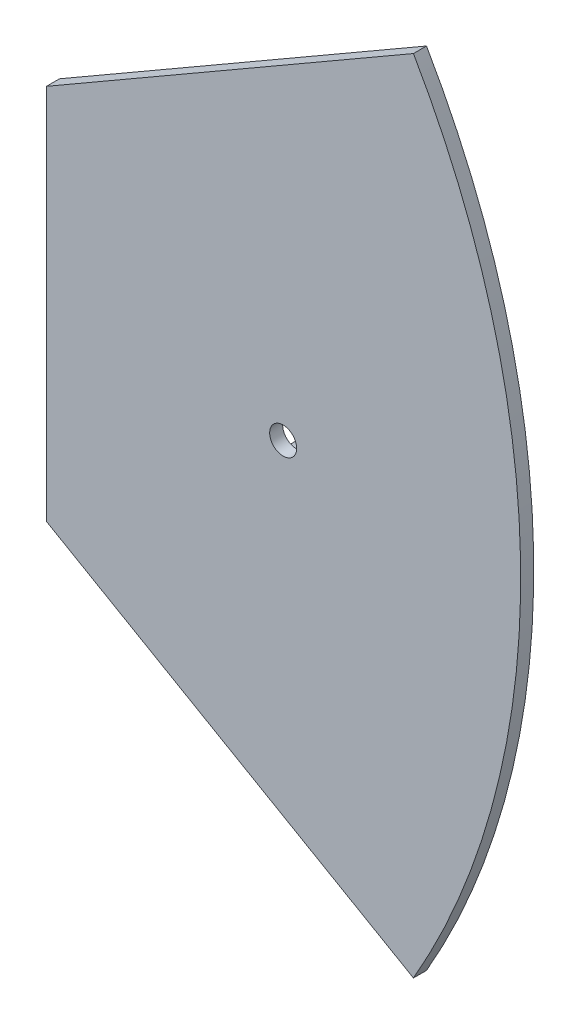
ISO-10303-21;
HEADER;
FILE_DESCRIPTION(('STEP AP214'),'2;1');
FILE_NAME('part.step','',(''),(''),'','','');
FILE_SCHEMA(('AUTOMOTIVE_DESIGN { 1 0 10303 214 1 1 1 1 }'));
ENDSEC;
DATA;
#1=APPLICATION_CONTEXT('core data for automotive mechanical design processes');
#2=APPLICATION_PROTOCOL_DEFINITION('international standard','automotive_design',2000,#1);
#3=PRODUCT_CONTEXT('',#1,'mechanical');
#4=PRODUCT('Part','Part','',(#3));
#5=PRODUCT_RELATED_PRODUCT_CATEGORY('part','',(#4));
#6=PRODUCT_DEFINITION_FORMATION('','',#4);
#7=PRODUCT_DEFINITION_CONTEXT('part definition',#1,'design');
#8=PRODUCT_DEFINITION('design','',#6,#7);
#9=PRODUCT_DEFINITION_SHAPE('','',#8);
#10=(LENGTH_UNIT() NAMED_UNIT(*) SI_UNIT(.MILLI.,.METRE.));
#11=(NAMED_UNIT(*) PLANE_ANGLE_UNIT() SI_UNIT($,.RADIAN.));
#12=(NAMED_UNIT(*) SI_UNIT($,.STERADIAN.) SOLID_ANGLE_UNIT());
#13=UNCERTAINTY_MEASURE_WITH_UNIT(LENGTH_MEASURE(1.E-05),#10,'distance_accuracy_value','');
#14=(GEOMETRIC_REPRESENTATION_CONTEXT(3) GLOBAL_UNCERTAINTY_ASSIGNED_CONTEXT((#13)) GLOBAL_UNIT_ASSIGNED_CONTEXT((#10,
#11,#12)) REPRESENTATION_CONTEXT('',''));
#15=CARTESIAN_POINT('',(0.,0.,0.));
#16=DIRECTION('',(0.,0.,1.));
#17=DIRECTION('',(1.,0.,0.));
#18=AXIS2_PLACEMENT_3D('',#15,#16,#17);
#19=CARTESIAN_POINT('',(0.,0.,44.));
#20=DIRECTION('',(0.,0.,1.));
#21=DIRECTION('',(1.,0.,0.));
#22=AXIS2_PLACEMENT_3D('',#19,#20,#21);
#23=PLANE('',#22);
#24=CARTESIAN_POINT('',(129.406241285554,0.,44.));
#25=DIRECTION('',(0.,0.,1.));
#26=DIRECTION('',(1.,0.,0.));
#27=AXIS2_PLACEMENT_3D('',#24,#25,#26);
#28=CIRCLE('',#27,3.09999999999999);
#29=CARTESIAN_POINT('',(132.506241285554,0.,44.));
#30=VERTEX_POINT('',#29);
#31=EDGE_CURVE('E153',#30,#30,#28,.T.);
#32=ORIENTED_EDGE('',*,*,#31,.T.);
#33=EDGE_LOOP('',(#32));
#34=FACE_BOUND('',#33,.T.);
#35=DIRECTION('',(0.,1.,0.));
#36=VECTOR('',#35,1.);
#37=CARTESIAN_POINT('',(133.812482571108,5.9529360582258,44.));
#38=LINE('',#37,#36);
#39=CARTESIAN_POINT('',(133.812482571108,5.9529360582258,44.));
#40=VERTEX_POINT('',#39);
#41=CARTESIAN_POINT('',(133.812482571109,21.8310469911582,44.));
#42=VERTEX_POINT('',#41);
#43=EDGE_CURVE('E206',#40,#42,#38,.T.);
#44=ORIENTED_EDGE('',*,*,#43,.T.);
#45=DIRECTION('',(-0.866025403784436,-0.500000000000005,0.));
#46=VECTOR('',#45,1.);
#47=CARTESIAN_POINT('',(133.812482571109,21.8310469911582,44.));
#48=LINE('',#47,#46);
#49=CARTESIAN_POINT('',(125.,16.7431578064997,44.));
#50=VERTEX_POINT('',#49);
#51=EDGE_CURVE('E196',#42,#50,#48,.T.);
#52=ORIENTED_EDGE('',*,*,#51,.T.);
#53=DIRECTION('',(0.,-1.,0.));
#54=VECTOR('',#53,1.);
#55=CARTESIAN_POINT('',(125.,16.7431578064997,44.));
#56=LINE('',#55,#54);
#57=CARTESIAN_POINT('',(125.,5.95293605822583,44.));
#58=VERTEX_POINT('',#57);
#59=EDGE_CURVE('E199',#50,#58,#56,.T.);
#60=ORIENTED_EDGE('',*,*,#59,.T.);
#61=CARTESIAN_POINT('',(129.406241285554,0.,44.));
#62=DIRECTION('',(0.,0.,-1.));
#63=DIRECTION('',(1.,0.,0.));
#64=AXIS2_PLACEMENT_3D('',#61,#62,#63);
#65=CIRCLE('',#64,7.40624128555422);
#66=EDGE_CURVE('E203',#58,#40,#65,.T.);
#67=ORIENTED_EDGE('',*,*,#66,.T.);
#68=EDGE_LOOP('',(#44,#52,#60,#67));
#69=FACE_BOUND('',#68,.T.);
#70=CARTESIAN_POINT('',(0.,0.,44.));
#71=DIRECTION('',(0.,0.,1.));
#72=DIRECTION('',(1.,0.,0.));
#73=AXIS2_PLACEMENT_3D('',#70,#71,#72);
#74=CIRCLE('',#73,184.);
#75=CARTESIAN_POINT('',(159.348674296336,-92.0000000000007,44.));
#76=VERTEX_POINT('',#75);
#77=CARTESIAN_POINT('',(159.348674296336,92.0000000000008,44.));
#78=VERTEX_POINT('',#77);
#79=EDGE_CURVE('E127',#76,#78,#74,.T.);
#80=ORIENTED_EDGE('',*,*,#79,.F.);
#81=DIRECTION('',(0.866025403784436,-0.500000000000004,0.));
#82=VECTOR('',#81,1.);
#83=CARTESIAN_POINT('',(75.,-43.3012701892224,44.));
#84=LINE('',#83,#82);
#85=CARTESIAN_POINT('',(75.,-43.3012701892224,44.));
#86=VERTEX_POINT('',#85);
#87=EDGE_CURVE('E188',#86,#76,#84,.T.);
#88=ORIENTED_EDGE('',*,*,#87,.F.);
#89=DIRECTION('',(0.,-1.,0.));
#90=VECTOR('',#89,1.);
#91=CARTESIAN_POINT('',(75.,43.3012701892224,44.));
#92=LINE('',#91,#90);
#93=CARTESIAN_POINT('',(75.,43.3012701892224,44.));
#94=VERTEX_POINT('',#93);
#95=EDGE_CURVE('E186',#94,#86,#92,.T.);
#96=ORIENTED_EDGE('',*,*,#95,.F.);
#97=DIRECTION('',(-0.866025403784436,-0.500000000000004,0.));
#98=VECTOR('',#97,1.);
#99=CARTESIAN_POINT('',(159.348674296336,92.0000000000008,44.));
#100=LINE('',#99,#98);
#101=EDGE_CURVE('E184',#78,#94,#100,.T.);
#102=ORIENTED_EDGE('',*,*,#101,.F.);
#103=EDGE_LOOP('',(#80,#88,#96,#102));
#104=FACE_BOUND('',#103,.T.);
#105=DIRECTION('',(0.866025403784436,-0.500000000000004,0.));
#106=VECTOR('',#105,1.);
#107=CARTESIAN_POINT('',(125.,-16.7431578064998,44.));
#108=LINE('',#107,#106);
#109=CARTESIAN_POINT('',(125.,-16.7431578064998,44.));
#110=VERTEX_POINT('',#109);
#111=CARTESIAN_POINT('',(133.812482571108,-21.8310469911582,44.));
#112=VERTEX_POINT('',#111);
#113=EDGE_CURVE('E47',#110,#112,#108,.T.);
#114=ORIENTED_EDGE('',*,*,#113,.T.);
#115=DIRECTION('',(0.,1.,0.));
#116=VECTOR('',#115,1.);
#117=CARTESIAN_POINT('',(133.812482571108,-21.8310469911582,44.));
#118=LINE('',#117,#116);
#119=CARTESIAN_POINT('',(133.812482571108,-5.95293605822582,44.));
#120=VERTEX_POINT('',#119);
#121=EDGE_CURVE('E51',#112,#120,#118,.T.);
#122=ORIENTED_EDGE('',*,*,#121,.T.);
#123=CARTESIAN_POINT('',(129.406241285554,0.,44.));
#124=DIRECTION('',(0.,0.,-1.));
#125=DIRECTION('',(1.,0.,0.));
#126=AXIS2_PLACEMENT_3D('',#123,#124,#125);
#127=CIRCLE('',#126,7.40624128555423);
#128=CARTESIAN_POINT('',(125.,-5.95293605822584,44.));
#129=VERTEX_POINT('',#128);
#130=EDGE_CURVE('E160',#120,#129,#127,.T.);
#131=ORIENTED_EDGE('',*,*,#130,.T.);
#132=DIRECTION('',(0.,-1.,0.));
#133=VECTOR('',#132,1.);
#134=CARTESIAN_POINT('',(125.,-5.95293605822584,44.));
#135=LINE('',#134,#133);
#136=EDGE_CURVE('E162',#129,#110,#135,.T.);
#137=ORIENTED_EDGE('',*,*,#136,.T.);
#138=EDGE_LOOP('',(#114,#122,#131,#137));
#139=FACE_BOUND('',#138,.T.);
#140=ADVANCED_FACE('F32',(#34,#69,#104,#139),#23,.F.);
#141=CARTESIAN_POINT('',(133.812482571109,21.8310469911582,44.));
#142=DIRECTION('',(0.500000000000005,-0.866025403784436,0.));
#143=DIRECTION('',(0.866025403784436,0.500000000000005,0.));
#144=AXIS2_PLACEMENT_3D('',#141,#142,#143);
#145=PLANE('',#144);
#146=DIRECTION('',(-0.866025403784436,-0.500000000000005,0.));
#147=VECTOR('',#146,1.);
#148=CARTESIAN_POINT('',(133.812482571109,21.8310469911582,22.));
#149=LINE('',#148,#147);
#150=CARTESIAN_POINT('',(133.812482571109,21.8310469911582,22.));
#151=VERTEX_POINT('',#150);
#152=CARTESIAN_POINT('',(125.,16.7431578064997,22.));
#153=VERTEX_POINT('',#152);
#154=EDGE_CURVE('E129',#151,#153,#149,.T.);
#155=ORIENTED_EDGE('',*,*,#154,.T.);
#156=DIRECTION('',(0.,0.,-1.));
#157=VECTOR('',#156,1.);
#158=CARTESIAN_POINT('',(125.,16.7431578064997,44.));
#159=LINE('',#158,#157);
#160=EDGE_CURVE('E11',#50,#153,#159,.T.);
#161=ORIENTED_EDGE('',*,*,#160,.F.);
#162=ORIENTED_EDGE('',*,*,#51,.F.);
#163=DIRECTION('',(0.,0.,-1.));
#164=VECTOR('',#163,1.);
#165=CARTESIAN_POINT('',(133.812482571109,21.8310469911582,44.));
#166=LINE('',#165,#164);
#167=EDGE_CURVE('E209',#42,#151,#166,.T.);
#168=ORIENTED_EDGE('',*,*,#167,.T.);
#169=EDGE_LOOP('',(#155,#161,#162,#168));
#170=FACE_BOUND('',#169,.T.);
#171=ADVANCED_FACE('F34',(#170),#145,.F.);
#172=CARTESIAN_POINT('',(125.,16.7431578064997,44.));
#173=DIRECTION('',(1.,0.,0.));
#174=DIRECTION('',(0.,1.,0.));
#175=AXIS2_PLACEMENT_3D('',#172,#173,#174);
#176=PLANE('',#175);
#177=DIRECTION('',(0.,-1.,0.));
#178=VECTOR('',#177,1.);
#179=CARTESIAN_POINT('',(125.,16.7431578064997,22.));
#180=LINE('',#179,#178);
#181=CARTESIAN_POINT('',(125.,5.95293605822583,22.));
#182=VERTEX_POINT('',#181);
#183=EDGE_CURVE('E212',#153,#182,#180,.T.);
#184=ORIENTED_EDGE('',*,*,#183,.T.);
#185=DIRECTION('',(0.,0.,-1.));
#186=VECTOR('',#185,1.);
#187=CARTESIAN_POINT('',(125.,5.95293605822583,44.));
#188=LINE('',#187,#186);
#189=EDGE_CURVE('E40',#58,#182,#188,.T.);
#190=ORIENTED_EDGE('',*,*,#189,.F.);
#191=ORIENTED_EDGE('',*,*,#59,.F.);
#192=ORIENTED_EDGE('',*,*,#160,.T.);
#193=EDGE_LOOP('',(#184,#190,#191,#192));
#194=FACE_BOUND('',#193,.T.);
#195=ADVANCED_FACE('F239',(#194),#176,.F.);
#196=CARTESIAN_POINT('',(129.406241285554,0.,44.));
#197=DIRECTION('',(0.,0.,-1.));
#198=DIRECTION('',(-1.,0.,0.));
#199=AXIS2_PLACEMENT_3D('',#196,#197,#198);
#200=CYLINDRICAL_SURFACE('',#199,7.40624128555422);
#201=CARTESIAN_POINT('',(129.406241285554,0.,22.));
#202=DIRECTION('',(0.,0.,-1.));
#203=DIRECTION('',(1.,0.,0.));
#204=AXIS2_PLACEMENT_3D('',#201,#202,#203);
#205=CIRCLE('',#204,7.40624128555422);
#206=CARTESIAN_POINT('',(133.812482571108,5.9529360582258,22.));
#207=VERTEX_POINT('',#206);
#208=EDGE_CURVE('E214',#182,#207,#205,.T.);
#209=ORIENTED_EDGE('',*,*,#208,.T.);
#210=DIRECTION('',(0.,0.,-1.));
#211=VECTOR('',#210,1.);
#212=CARTESIAN_POINT('',(133.812482571108,5.9529360582258,44.));
#213=LINE('',#212,#211);
#214=EDGE_CURVE('E219',#40,#207,#213,.T.);
#215=ORIENTED_EDGE('',*,*,#214,.F.);
#216=ORIENTED_EDGE('',*,*,#66,.F.);
#217=ORIENTED_EDGE('',*,*,#189,.T.);
#218=EDGE_LOOP('',(#209,#215,#216,#217));
#219=FACE_BOUND('',#218,.T.);
#220=ADVANCED_FACE('F225',(#219),#200,.F.);
#221=CARTESIAN_POINT('',(133.812482571108,5.9529360582258,44.));
#222=DIRECTION('',(-1.,0.,0.));
#223=DIRECTION('',(0.,-1.,0.));
#224=AXIS2_PLACEMENT_3D('',#221,#222,#223);
#225=PLANE('',#224);
#226=DIRECTION('',(0.,1.,0.));
#227=VECTOR('',#226,1.);
#228=CARTESIAN_POINT('',(133.812482571108,5.9529360582258,22.));
#229=LINE('',#228,#227);
#230=EDGE_CURVE('E200',#207,#151,#229,.T.);
#231=ORIENTED_EDGE('',*,*,#230,.T.);
#232=ORIENTED_EDGE('',*,*,#167,.F.);
#233=ORIENTED_EDGE('',*,*,#43,.F.);
#234=ORIENTED_EDGE('',*,*,#214,.T.);
#235=EDGE_LOOP('',(#231,#232,#233,#234));
#236=FACE_BOUND('',#235,.T.);
#237=ADVANCED_FACE('F233',(#236),#225,.F.);
#238=CARTESIAN_POINT('',(129.406241285554,0.,22.));
#239=DIRECTION('',(0.,0.,1.));
#240=DIRECTION('',(1.,0.,0.));
#241=AXIS2_PLACEMENT_3D('',#238,#239,#240);
#242=PLANE('',#241);
#243=ORIENTED_EDGE('',*,*,#154,.F.);
#244=ORIENTED_EDGE('',*,*,#230,.F.);
#245=ORIENTED_EDGE('',*,*,#208,.F.);
#246=ORIENTED_EDGE('',*,*,#183,.F.);
#247=EDGE_LOOP('',(#243,#244,#245,#246));
#248=FACE_BOUND('',#247,.T.);
#249=ADVANCED_FACE('F230',(#248),#242,.F.);
#250=CARTESIAN_POINT('',(0.,0.,45.));
#251=DIRECTION('',(0.,0.,-1.));
#252=DIRECTION('',(-1.,0.,0.));
#253=AXIS2_PLACEMENT_3D('',#250,#251,#252);
#254=CYLINDRICAL_SURFACE('',#253,184.);
#255=ORIENTED_EDGE('',*,*,#79,.T.);
#256=DIRECTION('',(0.,0.,-1.));
#257=VECTOR('',#256,1.);
#258=CARTESIAN_POINT('',(159.348674296336,92.0000000000008,45.));
#259=LINE('',#258,#257);
#260=CARTESIAN_POINT('',(159.348674296336,92.0000000000008,47.));
#261=VERTEX_POINT('',#260);
#262=EDGE_CURVE('E120',#261,#78,#259,.T.);
#263=ORIENTED_EDGE('',*,*,#262,.F.);
#264=CARTESIAN_POINT('',(0.,0.,47.));
#265=DIRECTION('',(0.,0.,1.));
#266=DIRECTION('',(1.,0.,0.));
#267=AXIS2_PLACEMENT_3D('',#264,#265,#266);
#268=CIRCLE('',#267,184.);
#269=CARTESIAN_POINT('',(159.348674296336,-92.0000000000008,47.));
#270=VERTEX_POINT('',#269);
#271=EDGE_CURVE('E125',#270,#261,#268,.T.);
#272=ORIENTED_EDGE('',*,*,#271,.F.);
#273=DIRECTION('',(0.,0.,-1.));
#274=VECTOR('',#273,1.);
#275=CARTESIAN_POINT('',(159.348674296336,-92.0000000000007,45.));
#276=LINE('',#275,#274);
#277=EDGE_CURVE('E190',#270,#76,#276,.T.);
#278=ORIENTED_EDGE('',*,*,#277,.T.);
#279=EDGE_LOOP('',(#255,#263,#272,#278));
#280=FACE_BOUND('',#279,.T.);
#281=ADVANCED_FACE('F122',(#280),#254,.T.);
#282=CARTESIAN_POINT('',(159.348674296336,92.0000000000008,45.));
#283=DIRECTION('',(0.500000000000004,-0.866025403784436,0.));
#284=DIRECTION('',(0.866025403784436,0.500000000000004,0.));
#285=AXIS2_PLACEMENT_3D('',#282,#283,#284);
#286=PLANE('',#285);
#287=ORIENTED_EDGE('',*,*,#101,.T.);
#288=DIRECTION('',(0.,0.,-1.));
#289=VECTOR('',#288,1.);
#290=CARTESIAN_POINT('',(75.,43.3012701892224,45.));
#291=LINE('',#290,#289);
#292=CARTESIAN_POINT('',(75.,43.3012701892224,47.));
#293=VERTEX_POINT('',#292);
#294=EDGE_CURVE('E130',#293,#94,#291,.T.);
#295=ORIENTED_EDGE('',*,*,#294,.F.);
#296=DIRECTION('',(-0.866025403784436,-0.500000000000004,0.));
#297=VECTOR('',#296,1.);
#298=CARTESIAN_POINT('',(159.348674296336,92.0000000000008,47.));
#299=LINE('',#298,#297);
#300=EDGE_CURVE('E133',#261,#293,#299,.T.);
#301=ORIENTED_EDGE('',*,*,#300,.F.);
#302=ORIENTED_EDGE('',*,*,#262,.T.);
#303=EDGE_LOOP('',(#287,#295,#301,#302));
#304=FACE_BOUND('',#303,.T.);
#305=ADVANCED_FACE('F134',(#304),#286,.F.);
#306=CARTESIAN_POINT('',(75.,43.3012701892224,45.));
#307=DIRECTION('',(1.,0.,0.));
#308=DIRECTION('',(0.,0.,-1.));
#309=AXIS2_PLACEMENT_3D('',#306,#307,#308);
#310=PLANE('',#309);
#311=ORIENTED_EDGE('',*,*,#95,.T.);
#312=DIRECTION('',(0.,0.,-1.));
#313=VECTOR('',#312,1.);
#314=CARTESIAN_POINT('',(75.,-43.3012701892224,45.));
#315=LINE('',#314,#313);
#316=CARTESIAN_POINT('',(75.,-43.3012701892224,47.));
#317=VERTEX_POINT('',#316);
#318=EDGE_CURVE('E192',#317,#86,#315,.T.);
#319=ORIENTED_EDGE('',*,*,#318,.F.);
#320=DIRECTION('',(0.,-1.,0.));
#321=VECTOR('',#320,1.);
#322=CARTESIAN_POINT('',(75.,43.3012701892224,47.));
#323=LINE('',#322,#321);
#324=EDGE_CURVE('E139',#293,#317,#323,.T.);
#325=ORIENTED_EDGE('',*,*,#324,.F.);
#326=ORIENTED_EDGE('',*,*,#294,.T.);
#327=EDGE_LOOP('',(#311,#319,#325,#326));
#328=FACE_BOUND('',#327,.T.);
#329=ADVANCED_FACE('F258',(#328),#310,.F.);
#330=CARTESIAN_POINT('',(75.,-43.3012701892224,45.));
#331=DIRECTION('',(0.500000000000004,0.866025403784436,0.));
#332=DIRECTION('',(-0.866025403784436,0.500000000000004,0.));
#333=AXIS2_PLACEMENT_3D('',#330,#331,#332);
#334=PLANE('',#333);
#335=ORIENTED_EDGE('',*,*,#87,.T.);
#336=ORIENTED_EDGE('',*,*,#277,.F.);
#337=DIRECTION('',(0.866025403784436,-0.500000000000005,0.));
#338=VECTOR('',#337,1.);
#339=CARTESIAN_POINT('',(75.,-43.3012701892224,47.));
#340=LINE('',#339,#338);
#341=EDGE_CURVE('E145',#317,#270,#340,.T.);
#342=ORIENTED_EDGE('',*,*,#341,.F.);
#343=ORIENTED_EDGE('',*,*,#318,.T.);
#344=EDGE_LOOP('',(#335,#336,#342,#343));
#345=FACE_BOUND('',#344,.T.);
#346=ADVANCED_FACE('F255',(#345),#334,.F.);
#347=CARTESIAN_POINT('',(125.,-16.7431578064998,44.));
#348=DIRECTION('',(0.500000000000004,0.866025403784436,0.));
#349=DIRECTION('',(-0.866025403784436,0.500000000000004,0.));
#350=AXIS2_PLACEMENT_3D('',#347,#348,#349);
#351=PLANE('',#350);
#352=DIRECTION('',(0.866025403784436,-0.500000000000004,0.));
#353=VECTOR('',#352,1.);
#354=CARTESIAN_POINT('',(125.,-16.7431578064998,22.));
#355=LINE('',#354,#353);
#356=CARTESIAN_POINT('',(125.,-16.7431578064998,22.));
#357=VERTEX_POINT('',#356);
#358=CARTESIAN_POINT('',(133.812482571108,-21.8310469911582,22.));
#359=VERTEX_POINT('',#358);
#360=EDGE_CURVE('E156',#357,#359,#355,.T.);
#361=ORIENTED_EDGE('',*,*,#360,.T.);
#362=DIRECTION('',(0.,0.,-1.));
#363=VECTOR('',#362,1.);
#364=CARTESIAN_POINT('',(133.812482571108,-21.8310469911582,44.));
#365=LINE('',#364,#363);
#366=EDGE_CURVE('E180',#112,#359,#365,.T.);
#367=ORIENTED_EDGE('',*,*,#366,.F.);
#368=ORIENTED_EDGE('',*,*,#113,.F.);
#369=DIRECTION('',(0.,0.,-1.));
#370=VECTOR('',#369,1.);
#371=CARTESIAN_POINT('',(125.,-16.7431578064998,44.));
#372=LINE('',#371,#370);
#373=EDGE_CURVE('E164',#110,#357,#372,.T.);
#374=ORIENTED_EDGE('',*,*,#373,.T.);
#375=EDGE_LOOP('',(#361,#367,#368,#374));
#376=FACE_BOUND('',#375,.T.);
#377=ADVANCED_FACE('F253',(#376),#351,.F.);
#378=CARTESIAN_POINT('',(133.812482571108,-21.8310469911582,44.));
#379=DIRECTION('',(-1.,0.,0.));
#380=DIRECTION('',(0.,-1.,0.));
#381=AXIS2_PLACEMENT_3D('',#378,#379,#380);
#382=PLANE('',#381);
#383=DIRECTION('',(0.,1.,0.));
#384=VECTOR('',#383,1.);
#385=CARTESIAN_POINT('',(133.812482571108,-21.8310469911582,22.));
#386=LINE('',#385,#384);
#387=CARTESIAN_POINT('',(133.812482571108,-5.95293605822582,22.));
#388=VERTEX_POINT('',#387);
#389=EDGE_CURVE('E167',#359,#388,#386,.T.);
#390=ORIENTED_EDGE('',*,*,#389,.T.);
#391=DIRECTION('',(0.,0.,-1.));
#392=VECTOR('',#391,1.);
#393=CARTESIAN_POINT('',(133.812482571108,-5.95293605822582,44.));
#394=LINE('',#393,#392);
#395=EDGE_CURVE('E177',#120,#388,#394,.T.);
#396=ORIENTED_EDGE('',*,*,#395,.F.);
#397=ORIENTED_EDGE('',*,*,#121,.F.);
#398=ORIENTED_EDGE('',*,*,#366,.T.);
#399=EDGE_LOOP('',(#390,#396,#397,#398));
#400=FACE_BOUND('',#399,.T.);
#401=ADVANCED_FACE('F304',(#400),#382,.F.);
#402=CARTESIAN_POINT('',(129.406241285554,0.,44.));
#403=DIRECTION('',(0.,0.,-1.));
#404=DIRECTION('',(-1.,0.,0.));
#405=AXIS2_PLACEMENT_3D('',#402,#403,#404);
#406=CYLINDRICAL_SURFACE('',#405,7.40624128555423);
#407=CARTESIAN_POINT('',(129.406241285554,0.,22.));
#408=DIRECTION('',(0.,0.,-1.));
#409=DIRECTION('',(1.,0.,0.));
#410=AXIS2_PLACEMENT_3D('',#407,#408,#409);
#411=CIRCLE('',#410,7.40624128555423);
#412=CARTESIAN_POINT('',(125.,-5.95293605822584,22.));
#413=VERTEX_POINT('',#412);
#414=EDGE_CURVE('E169',#388,#413,#411,.T.);
#415=ORIENTED_EDGE('',*,*,#414,.T.);
#416=DIRECTION('',(0.,0.,-1.));
#417=VECTOR('',#416,1.);
#418=CARTESIAN_POINT('',(125.,-5.95293605822584,44.));
#419=LINE('',#418,#417);
#420=EDGE_CURVE('E174',#129,#413,#419,.T.);
#421=ORIENTED_EDGE('',*,*,#420,.F.);
#422=ORIENTED_EDGE('',*,*,#130,.F.);
#423=ORIENTED_EDGE('',*,*,#395,.T.);
#424=EDGE_LOOP('',(#415,#421,#422,#423));
#425=FACE_BOUND('',#424,.T.);
#426=ADVANCED_FACE('F313',(#425),#406,.F.);
#427=CARTESIAN_POINT('',(125.,-5.95293605822584,44.));
#428=DIRECTION('',(1.,0.,0.));
#429=DIRECTION('',(0.,0.,-1.));
#430=AXIS2_PLACEMENT_3D('',#427,#428,#429);
#431=PLANE('',#430);
#432=DIRECTION('',(0.,-1.,0.));
#433=VECTOR('',#432,1.);
#434=CARTESIAN_POINT('',(125.,-5.95293605822584,22.));
#435=LINE('',#434,#433);
#436=EDGE_CURVE('E158',#413,#357,#435,.T.);
#437=ORIENTED_EDGE('',*,*,#436,.T.);
#438=ORIENTED_EDGE('',*,*,#373,.F.);
#439=ORIENTED_EDGE('',*,*,#136,.F.);
#440=ORIENTED_EDGE('',*,*,#420,.T.);
#441=EDGE_LOOP('',(#437,#438,#439,#440));
#442=FACE_BOUND('',#441,.T.);
#443=ADVANCED_FACE('F321',(#442),#431,.F.);
#444=CARTESIAN_POINT('',(129.406241285554,0.,22.));
#445=DIRECTION('',(0.,0.,1.));
#446=DIRECTION('',(1.,0.,0.));
#447=AXIS2_PLACEMENT_3D('',#444,#445,#446);
#448=PLANE('',#447);
#449=ORIENTED_EDGE('',*,*,#360,.F.);
#450=ORIENTED_EDGE('',*,*,#436,.F.);
#451=ORIENTED_EDGE('',*,*,#414,.F.);
#452=ORIENTED_EDGE('',*,*,#389,.F.);
#453=EDGE_LOOP('',(#449,#450,#451,#452));
#454=FACE_BOUND('',#453,.T.);
#455=ADVANCED_FACE('F330',(#454),#448,.F.);
#456=CARTESIAN_POINT('',(129.406241285554,0.,45.));
#457=DIRECTION('',(0.,0.,-1.));
#458=DIRECTION('',(-1.,0.,0.));
#459=AXIS2_PLACEMENT_3D('',#456,#457,#458);
#460=CYLINDRICAL_SURFACE('',#459,3.09999999999999);
#461=ORIENTED_EDGE('',*,*,#31,.F.);
#462=EDGE_LOOP('',(#461));
#463=FACE_BOUND('',#462,.T.);
#464=CARTESIAN_POINT('',(129.406241285554,0.,47.));
#465=DIRECTION('',(0.,0.,1.));
#466=DIRECTION('',(1.,0.,0.));
#467=AXIS2_PLACEMENT_3D('',#464,#465,#466);
#468=CIRCLE('',#467,3.09999999999999);
#469=CARTESIAN_POINT('',(132.506241285554,0.,47.));
#470=VERTEX_POINT('',#469);
#471=EDGE_CURVE('E146',#470,#470,#468,.T.);
#472=ORIENTED_EDGE('',*,*,#471,.T.);
#473=EDGE_LOOP('',(#472));
#474=FACE_BOUND('',#473,.T.);
#475=ADVANCED_FACE('F339',(#463,#474),#460,.F.);
#476=CARTESIAN_POINT('',(0.,0.,47.));
#477=DIRECTION('',(0.,0.,1.));
#478=DIRECTION('',(1.,0.,0.));
#479=AXIS2_PLACEMENT_3D('',#476,#477,#478);
#480=PLANE('',#479);
#481=ORIENTED_EDGE('',*,*,#271,.T.);
#482=ORIENTED_EDGE('',*,*,#300,.T.);
#483=ORIENTED_EDGE('',*,*,#324,.T.);
#484=ORIENTED_EDGE('',*,*,#341,.T.);
#485=EDGE_LOOP('',(#481,#482,#483,#484));
#486=FACE_BOUND('',#485,.T.);
#487=ORIENTED_EDGE('',*,*,#471,.F.);
#488=EDGE_LOOP('',(#487));
#489=FACE_BOUND('',#488,.T.);
#490=ADVANCED_FACE('F142',(#486,#489),#480,.T.);
#491=CLOSED_SHELL('',(#140,#171,#195,#220,#237,#249,#281,#305,#329,#346,#377,#401,#426,#443,
#455,#475,#490));
#492=MANIFOLD_SOLID_BREP('B2',#491);
#493=ADVANCED_BREP_SHAPE_REPRESENTATION('',(#18,#492),#14);
#494=SHAPE_DEFINITION_REPRESENTATION(#9,#493);
ENDSEC;
END-ISO-10303-21;
